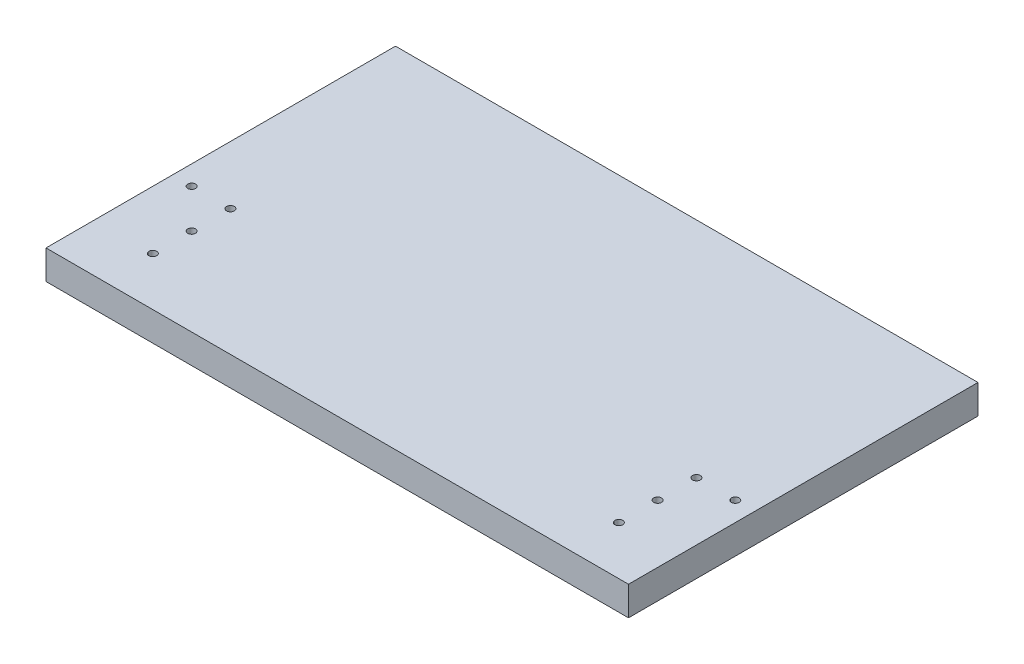
ISO-10303-21;
HEADER;
FILE_DESCRIPTION(('STEP AP214'),'2;1');
FILE_NAME('part.step','',(''),(''),'','','');
FILE_SCHEMA(('AUTOMOTIVE_DESIGN { 1 0 10303 214 1 1 1 1 }'));
ENDSEC;
DATA;
#1=APPLICATION_CONTEXT('core data for automotive mechanical design processes');
#2=APPLICATION_PROTOCOL_DEFINITION('international standard','automotive_design',2000,#1);
#3=PRODUCT_CONTEXT('',#1,'mechanical');
#4=PRODUCT('Part','Part','',(#3));
#5=PRODUCT_RELATED_PRODUCT_CATEGORY('part','',(#4));
#6=PRODUCT_DEFINITION_FORMATION('','',#4);
#7=PRODUCT_DEFINITION_CONTEXT('part definition',#1,'design');
#8=PRODUCT_DEFINITION('design','',#6,#7);
#9=PRODUCT_DEFINITION_SHAPE('','',#8);
#10=(LENGTH_UNIT() NAMED_UNIT(*) SI_UNIT(.MILLI.,.METRE.));
#11=(NAMED_UNIT(*) PLANE_ANGLE_UNIT() SI_UNIT($,.RADIAN.));
#12=(NAMED_UNIT(*) SI_UNIT($,.STERADIAN.) SOLID_ANGLE_UNIT());
#13=UNCERTAINTY_MEASURE_WITH_UNIT(LENGTH_MEASURE(1.E-05),#10,'distance_accuracy_value','');
#14=(GEOMETRIC_REPRESENTATION_CONTEXT(3) GLOBAL_UNCERTAINTY_ASSIGNED_CONTEXT((#13)) GLOBAL_UNIT_ASSIGNED_CONTEXT((#10,
#11,#12)) REPRESENTATION_CONTEXT('',''));
#15=CARTESIAN_POINT('',(0.,0.,0.));
#16=DIRECTION('',(0.,0.,1.));
#17=DIRECTION('',(1.,0.,0.));
#18=AXIS2_PLACEMENT_3D('',#15,#16,#17);
#19=CARTESIAN_POINT('',(150.,15.,90.));
#20=DIRECTION('',(-1.,0.,0.));
#21=DIRECTION('',(0.,0.,1.));
#22=AXIS2_PLACEMENT_3D('',#19,#20,#21);
#23=PLANE('',#22);
#24=DIRECTION('',(0.,0.,-1.));
#25=VECTOR('',#24,1.);
#26=CARTESIAN_POINT('',(150.,0.,90.));
#27=LINE('',#26,#25);
#28=CARTESIAN_POINT('',(150.,0.,90.));
#29=VERTEX_POINT('',#28);
#30=CARTESIAN_POINT('',(150.,0.,-90.));
#31=VERTEX_POINT('',#30);
#32=EDGE_CURVE('E95',#29,#31,#27,.T.);
#33=ORIENTED_EDGE('',*,*,#32,.T.);
#34=DIRECTION('',(0.,-1.,0.));
#35=VECTOR('',#34,1.);
#36=CARTESIAN_POINT('',(150.,15.,-90.));
#37=LINE('',#36,#35);
#38=CARTESIAN_POINT('',(150.,15.,-90.));
#39=VERTEX_POINT('',#38);
#40=EDGE_CURVE('E11',#39,#31,#37,.T.);
#41=ORIENTED_EDGE('',*,*,#40,.F.);
#42=DIRECTION('',(0.,0.,-1.));
#43=VECTOR('',#42,1.);
#44=CARTESIAN_POINT('',(150.,15.,90.));
#45=LINE('',#44,#43);
#46=CARTESIAN_POINT('',(150.,15.,90.));
#47=VERTEX_POINT('',#46);
#48=EDGE_CURVE('E83',#47,#39,#45,.T.);
#49=ORIENTED_EDGE('',*,*,#48,.F.);
#50=DIRECTION('',(0.,-1.,0.));
#51=VECTOR('',#50,1.);
#52=CARTESIAN_POINT('',(150.,15.,90.));
#53=LINE('',#52,#51);
#54=EDGE_CURVE('E91',#47,#29,#53,.T.);
#55=ORIENTED_EDGE('',*,*,#54,.T.);
#56=EDGE_LOOP('',(#33,#41,#49,#55));
#57=FACE_BOUND('',#56,.T.);
#58=ADVANCED_FACE('F32',(#57),#23,.F.);
#59=CARTESIAN_POINT('',(-150.,15.,-90.));
#60=DIRECTION('',(0.,0.,1.));
#61=DIRECTION('',(1.,0.,0.));
#62=AXIS2_PLACEMENT_3D('',#59,#60,#61);
#63=PLANE('',#62);
#64=DIRECTION('',(-1.,0.,0.));
#65=VECTOR('',#64,1.);
#66=CARTESIAN_POINT('',(-150.,0.,-90.));
#67=LINE('',#66,#65);
#68=CARTESIAN_POINT('',(-150.,0.,-90.));
#69=VERTEX_POINT('',#68);
#70=EDGE_CURVE('E87',#31,#69,#67,.T.);
#71=ORIENTED_EDGE('',*,*,#70,.T.);
#72=DIRECTION('',(0.,-1.,0.));
#73=VECTOR('',#72,1.);
#74=CARTESIAN_POINT('',(-150.,15.,-90.));
#75=LINE('',#74,#73);
#76=CARTESIAN_POINT('',(-150.,15.,-90.));
#77=VERTEX_POINT('',#76);
#78=EDGE_CURVE('E40',#77,#69,#75,.T.);
#79=ORIENTED_EDGE('',*,*,#78,.F.);
#80=DIRECTION('',(-1.,0.,0.));
#81=VECTOR('',#80,1.);
#82=CARTESIAN_POINT('',(-150.,15.,-90.));
#83=LINE('',#82,#81);
#84=EDGE_CURVE('E78',#39,#77,#83,.T.);
#85=ORIENTED_EDGE('',*,*,#84,.F.);
#86=ORIENTED_EDGE('',*,*,#40,.T.);
#87=EDGE_LOOP('',(#71,#79,#85,#86));
#88=FACE_BOUND('',#87,.T.);
#89=ADVANCED_FACE('F86',(#88),#63,.F.);
#90=CARTESIAN_POINT('',(-150.,15.,90.));
#91=DIRECTION('',(1.,0.,0.));
#92=DIRECTION('',(0.,0.,-1.));
#93=AXIS2_PLACEMENT_3D('',#90,#91,#92);
#94=PLANE('',#93);
#95=DIRECTION('',(0.,0.,1.));
#96=VECTOR('',#95,1.);
#97=CARTESIAN_POINT('',(-150.,0.,90.));
#98=LINE('',#97,#96);
#99=CARTESIAN_POINT('',(-150.,0.,90.));
#100=VERTEX_POINT('',#99);
#101=EDGE_CURVE('E65',#69,#100,#98,.T.);
#102=ORIENTED_EDGE('',*,*,#101,.T.);
#103=DIRECTION('',(0.,-1.,0.));
#104=VECTOR('',#103,1.);
#105=CARTESIAN_POINT('',(-150.,15.,90.));
#106=LINE('',#105,#104);
#107=CARTESIAN_POINT('',(-150.,15.,90.));
#108=VERTEX_POINT('',#107);
#109=EDGE_CURVE('E88',#108,#100,#106,.T.);
#110=ORIENTED_EDGE('',*,*,#109,.F.);
#111=DIRECTION('',(0.,0.,1.));
#112=VECTOR('',#111,1.);
#113=CARTESIAN_POINT('',(-150.,15.,90.));
#114=LINE('',#113,#112);
#115=EDGE_CURVE('E81',#77,#108,#114,.T.);
#116=ORIENTED_EDGE('',*,*,#115,.F.);
#117=ORIENTED_EDGE('',*,*,#78,.T.);
#118=EDGE_LOOP('',(#102,#110,#116,#117));
#119=FACE_BOUND('',#118,.T.);
#120=ADVANCED_FACE('F89',(#119),#94,.F.);
#121=CARTESIAN_POINT('',(-150.,15.,90.));
#122=DIRECTION('',(0.,0.,-1.));
#123=DIRECTION('',(-1.,0.,0.));
#124=AXIS2_PLACEMENT_3D('',#121,#122,#123);
#125=PLANE('',#124);
#126=DIRECTION('',(1.,0.,0.));
#127=VECTOR('',#126,1.);
#128=CARTESIAN_POINT('',(-150.,0.,90.));
#129=LINE('',#128,#127);
#130=EDGE_CURVE('E71',#100,#29,#129,.T.);
#131=ORIENTED_EDGE('',*,*,#130,.T.);
#132=ORIENTED_EDGE('',*,*,#54,.F.);
#133=DIRECTION('',(1.,0.,0.));
#134=VECTOR('',#133,1.);
#135=CARTESIAN_POINT('',(-150.,15.,90.));
#136=LINE('',#135,#134);
#137=EDGE_CURVE('E48',#108,#47,#136,.T.);
#138=ORIENTED_EDGE('',*,*,#137,.F.);
#139=ORIENTED_EDGE('',*,*,#109,.T.);
#140=EDGE_LOOP('',(#131,#132,#138,#139));
#141=FACE_BOUND('',#140,.T.);
#142=ADVANCED_FACE('F103',(#141),#125,.F.);
#143=CARTESIAN_POINT('',(0.,15.,0.));
#144=DIRECTION('',(0.,-1.,0.));
#145=DIRECTION('',(0.,0.,-1.));
#146=AXIS2_PLACEMENT_3D('',#143,#144,#145);
#147=PLANE('',#146);
#148=CARTESIAN_POINT('',(140.,15.,25.));
#149=DIRECTION('',(0.,1.,0.));
#150=DIRECTION('',(0.,0.,1.));
#151=AXIS2_PLACEMENT_3D('',#148,#149,#150);
#152=CIRCLE('',#151,2.);
#153=CARTESIAN_POINT('',(140.,15.,27.));
#154=VERTEX_POINT('',#153);
#155=EDGE_CURVE('E151',#154,#154,#152,.T.);
#156=ORIENTED_EDGE('',*,*,#155,.F.);
#157=EDGE_LOOP('',(#156));
#158=FACE_BOUND('',#157,.T.);
#159=CARTESIAN_POINT('',(120.,15.,25.));
#160=DIRECTION('',(0.,1.,0.));
#161=DIRECTION('',(0.,0.,1.));
#162=AXIS2_PLACEMENT_3D('',#159,#160,#161);
#163=CIRCLE('',#162,2.);
#164=CARTESIAN_POINT('',(120.,15.,27.));
#165=VERTEX_POINT('',#164);
#166=EDGE_CURVE('E145',#165,#165,#163,.T.);
#167=ORIENTED_EDGE('',*,*,#166,.F.);
#168=EDGE_LOOP('',(#167));
#169=FACE_BOUND('',#168,.T.);
#170=CARTESIAN_POINT('',(-120.,15.,25.));
#171=DIRECTION('',(0.,1.,0.));
#172=DIRECTION('',(0.,0.,1.));
#173=AXIS2_PLACEMENT_3D('',#170,#171,#172);
#174=CIRCLE('',#173,2.);
#175=CARTESIAN_POINT('',(-120.,15.,27.));
#176=VERTEX_POINT('',#175);
#177=EDGE_CURVE('E139',#176,#176,#174,.T.);
#178=ORIENTED_EDGE('',*,*,#177,.F.);
#179=EDGE_LOOP('',(#178));
#180=FACE_BOUND('',#179,.T.);
#181=CARTESIAN_POINT('',(-140.,15.,25.));
#182=DIRECTION('',(0.,1.,0.));
#183=DIRECTION('',(0.,0.,1.));
#184=AXIS2_PLACEMENT_3D('',#181,#182,#183);
#185=CIRCLE('',#184,2.);
#186=CARTESIAN_POINT('',(-140.,15.,27.));
#187=VERTEX_POINT('',#186);
#188=EDGE_CURVE('E133',#187,#187,#185,.T.);
#189=ORIENTED_EDGE('',*,*,#188,.F.);
#190=EDGE_LOOP('',(#189));
#191=FACE_BOUND('',#190,.T.);
#192=CARTESIAN_POINT('',(120.,15.,45.));
#193=DIRECTION('',(0.,1.,0.));
#194=DIRECTION('',(0.,0.,1.));
#195=AXIS2_PLACEMENT_3D('',#192,#193,#194);
#196=CIRCLE('',#195,2.);
#197=CARTESIAN_POINT('',(120.,15.,47.));
#198=VERTEX_POINT('',#197);
#199=EDGE_CURVE('E127',#198,#198,#196,.T.);
#200=ORIENTED_EDGE('',*,*,#199,.F.);
#201=EDGE_LOOP('',(#200));
#202=FACE_BOUND('',#201,.T.);
#203=CARTESIAN_POINT('',(120.,15.,65.));
#204=DIRECTION('',(0.,1.,0.));
#205=DIRECTION('',(0.,0.,1.));
#206=AXIS2_PLACEMENT_3D('',#203,#204,#205);
#207=CIRCLE('',#206,2.);
#208=CARTESIAN_POINT('',(120.,15.,67.));
#209=VERTEX_POINT('',#208);
#210=EDGE_CURVE('E121',#209,#209,#207,.T.);
#211=ORIENTED_EDGE('',*,*,#210,.F.);
#212=EDGE_LOOP('',(#211));
#213=FACE_BOUND('',#212,.T.);
#214=CARTESIAN_POINT('',(-120.,15.,45.));
#215=DIRECTION('',(0.,1.,0.));
#216=DIRECTION('',(0.,0.,1.));
#217=AXIS2_PLACEMENT_3D('',#214,#215,#216);
#218=CIRCLE('',#217,2.);
#219=CARTESIAN_POINT('',(-120.,15.,47.));
#220=VERTEX_POINT('',#219);
#221=EDGE_CURVE('E115',#220,#220,#218,.T.);
#222=ORIENTED_EDGE('',*,*,#221,.F.);
#223=EDGE_LOOP('',(#222));
#224=FACE_BOUND('',#223,.T.);
#225=CARTESIAN_POINT('',(-120.,15.,65.));
#226=DIRECTION('',(0.,1.,0.));
#227=DIRECTION('',(0.,0.,1.));
#228=AXIS2_PLACEMENT_3D('',#225,#226,#227);
#229=CIRCLE('',#228,2.);
#230=CARTESIAN_POINT('',(-120.,15.,67.));
#231=VERTEX_POINT('',#230);
#232=EDGE_CURVE('E109',#231,#231,#229,.T.);
#233=ORIENTED_EDGE('',*,*,#232,.F.);
#234=EDGE_LOOP('',(#233));
#235=FACE_BOUND('',#234,.T.);
#236=ORIENTED_EDGE('',*,*,#48,.T.);
#237=ORIENTED_EDGE('',*,*,#84,.T.);
#238=ORIENTED_EDGE('',*,*,#115,.T.);
#239=ORIENTED_EDGE('',*,*,#137,.T.);
#240=EDGE_LOOP('',(#236,#237,#238,#239));
#241=FACE_BOUND('',#240,.T.);
#242=ADVANCED_FACE('F79',(#158,#169,#180,#191,#202,#213,#224,#235,#241),#147,.F.);
#243=CARTESIAN_POINT('',(0.,0.,0.));
#244=DIRECTION('',(0.,-1.,0.));
#245=DIRECTION('',(0.,0.,-1.));
#246=AXIS2_PLACEMENT_3D('',#243,#244,#245);
#247=PLANE('',#246);
#248=ORIENTED_EDGE('',*,*,#32,.F.);
#249=ORIENTED_EDGE('',*,*,#130,.F.);
#250=ORIENTED_EDGE('',*,*,#101,.F.);
#251=ORIENTED_EDGE('',*,*,#70,.F.);
#252=EDGE_LOOP('',(#248,#249,#250,#251));
#253=FACE_BOUND('',#252,.T.);
#254=ADVANCED_FACE('F106',(#253),#247,.T.);
#255=CARTESIAN_POINT('',(-120.,5.,65.));
#256=DIRECTION('',(0.,1.,0.));
#257=DIRECTION('',(0.,0.,1.));
#258=AXIS2_PLACEMENT_3D('',#255,#256,#257);
#259=CYLINDRICAL_SURFACE('',#258,2.);
#260=CARTESIAN_POINT('',(-120.,5.,65.));
#261=DIRECTION('',(0.,1.,0.));
#262=DIRECTION('',(0.,0.,1.));
#263=AXIS2_PLACEMENT_3D('',#260,#261,#262);
#264=CIRCLE('',#263,2.);
#265=CARTESIAN_POINT('',(-120.,5.,67.));
#266=VERTEX_POINT('',#265);
#267=EDGE_CURVE('E98',#266,#266,#264,.T.);
#268=ORIENTED_EDGE('',*,*,#267,.F.);
#269=EDGE_LOOP('',(#268));
#270=FACE_BOUND('',#269,.T.);
#271=ORIENTED_EDGE('',*,*,#232,.T.);
#272=EDGE_LOOP('',(#271));
#273=FACE_BOUND('',#272,.T.);
#274=ADVANCED_FACE('F183',(#270,#273),#259,.F.);
#275=CARTESIAN_POINT('',(-120.,5.,65.));
#276=DIRECTION('',(0.,1.,0.));
#277=DIRECTION('',(0.,0.,1.));
#278=AXIS2_PLACEMENT_3D('',#275,#276,#277);
#279=PLANE('',#278);
#280=ORIENTED_EDGE('',*,*,#267,.T.);
#281=EDGE_LOOP('',(#280));
#282=FACE_BOUND('',#281,.T.);
#283=ADVANCED_FACE('F185',(#282),#279,.T.);
#284=CARTESIAN_POINT('',(-120.,5.,45.));
#285=DIRECTION('',(0.,1.,0.));
#286=DIRECTION('',(0.,0.,1.));
#287=AXIS2_PLACEMENT_3D('',#284,#285,#286);
#288=CYLINDRICAL_SURFACE('',#287,2.);
#289=CARTESIAN_POINT('',(-120.,5.,45.));
#290=DIRECTION('',(0.,1.,0.));
#291=DIRECTION('',(0.,0.,1.));
#292=AXIS2_PLACEMENT_3D('',#289,#290,#291);
#293=CIRCLE('',#292,2.);
#294=CARTESIAN_POINT('',(-120.,5.,47.));
#295=VERTEX_POINT('',#294);
#296=EDGE_CURVE('E112',#295,#295,#293,.T.);
#297=ORIENTED_EDGE('',*,*,#296,.F.);
#298=EDGE_LOOP('',(#297));
#299=FACE_BOUND('',#298,.T.);
#300=ORIENTED_EDGE('',*,*,#221,.T.);
#301=EDGE_LOOP('',(#300));
#302=FACE_BOUND('',#301,.T.);
#303=ADVANCED_FACE('F192',(#299,#302),#288,.F.);
#304=CARTESIAN_POINT('',(-120.,5.,45.));
#305=DIRECTION('',(0.,1.,0.));
#306=DIRECTION('',(0.,0.,1.));
#307=AXIS2_PLACEMENT_3D('',#304,#305,#306);
#308=PLANE('',#307);
#309=ORIENTED_EDGE('',*,*,#296,.T.);
#310=EDGE_LOOP('',(#309));
#311=FACE_BOUND('',#310,.T.);
#312=ADVANCED_FACE('F240',(#311),#308,.T.);
#313=CARTESIAN_POINT('',(120.,5.,65.));
#314=DIRECTION('',(0.,1.,0.));
#315=DIRECTION('',(0.,0.,1.));
#316=AXIS2_PLACEMENT_3D('',#313,#314,#315);
#317=CYLINDRICAL_SURFACE('',#316,2.);
#318=CARTESIAN_POINT('',(120.,5.,65.));
#319=DIRECTION('',(0.,1.,0.));
#320=DIRECTION('',(0.,0.,1.));
#321=AXIS2_PLACEMENT_3D('',#318,#319,#320);
#322=CIRCLE('',#321,2.);
#323=CARTESIAN_POINT('',(120.,5.,67.));
#324=VERTEX_POINT('',#323);
#325=EDGE_CURVE('E118',#324,#324,#322,.T.);
#326=ORIENTED_EDGE('',*,*,#325,.F.);
#327=EDGE_LOOP('',(#326));
#328=FACE_BOUND('',#327,.T.);
#329=ORIENTED_EDGE('',*,*,#210,.T.);
#330=EDGE_LOOP('',(#329));
#331=FACE_BOUND('',#330,.T.);
#332=ADVANCED_FACE('F249',(#328,#331),#317,.F.);
#333=CARTESIAN_POINT('',(120.,5.,65.));
#334=DIRECTION('',(0.,1.,0.));
#335=DIRECTION('',(0.,0.,1.));
#336=AXIS2_PLACEMENT_3D('',#333,#334,#335);
#337=PLANE('',#336);
#338=ORIENTED_EDGE('',*,*,#325,.T.);
#339=EDGE_LOOP('',(#338));
#340=FACE_BOUND('',#339,.T.);
#341=ADVANCED_FACE('F258',(#340),#337,.T.);
#342=CARTESIAN_POINT('',(120.,5.,45.));
#343=DIRECTION('',(0.,1.,0.));
#344=DIRECTION('',(0.,0.,1.));
#345=AXIS2_PLACEMENT_3D('',#342,#343,#344);
#346=CYLINDRICAL_SURFACE('',#345,2.);
#347=CARTESIAN_POINT('',(120.,5.,45.));
#348=DIRECTION('',(0.,1.,0.));
#349=DIRECTION('',(0.,0.,1.));
#350=AXIS2_PLACEMENT_3D('',#347,#348,#349);
#351=CIRCLE('',#350,2.);
#352=CARTESIAN_POINT('',(120.,5.,47.));
#353=VERTEX_POINT('',#352);
#354=EDGE_CURVE('E124',#353,#353,#351,.T.);
#355=ORIENTED_EDGE('',*,*,#354,.F.);
#356=EDGE_LOOP('',(#355));
#357=FACE_BOUND('',#356,.T.);
#358=ORIENTED_EDGE('',*,*,#199,.T.);
#359=EDGE_LOOP('',(#358));
#360=FACE_BOUND('',#359,.T.);
#361=ADVANCED_FACE('F267',(#357,#360),#346,.F.);
#362=CARTESIAN_POINT('',(120.,5.,45.));
#363=DIRECTION('',(0.,1.,0.));
#364=DIRECTION('',(0.,0.,1.));
#365=AXIS2_PLACEMENT_3D('',#362,#363,#364);
#366=PLANE('',#365);
#367=ORIENTED_EDGE('',*,*,#354,.T.);
#368=EDGE_LOOP('',(#367));
#369=FACE_BOUND('',#368,.T.);
#370=ADVANCED_FACE('F276',(#369),#366,.T.);
#371=CARTESIAN_POINT('',(-140.,5.,25.));
#372=DIRECTION('',(0.,1.,0.));
#373=DIRECTION('',(0.,0.,1.));
#374=AXIS2_PLACEMENT_3D('',#371,#372,#373);
#375=CYLINDRICAL_SURFACE('',#374,2.);
#376=CARTESIAN_POINT('',(-140.,5.,25.));
#377=DIRECTION('',(0.,1.,0.));
#378=DIRECTION('',(0.,0.,1.));
#379=AXIS2_PLACEMENT_3D('',#376,#377,#378);
#380=CIRCLE('',#379,2.);
#381=CARTESIAN_POINT('',(-140.,5.,27.));
#382=VERTEX_POINT('',#381);
#383=EDGE_CURVE('E130',#382,#382,#380,.T.);
#384=ORIENTED_EDGE('',*,*,#383,.F.);
#385=EDGE_LOOP('',(#384));
#386=FACE_BOUND('',#385,.T.);
#387=ORIENTED_EDGE('',*,*,#188,.T.);
#388=EDGE_LOOP('',(#387));
#389=FACE_BOUND('',#388,.T.);
#390=ADVANCED_FACE('F285',(#386,#389),#375,.F.);
#391=CARTESIAN_POINT('',(-140.,5.,25.));
#392=DIRECTION('',(0.,1.,0.));
#393=DIRECTION('',(0.,0.,1.));
#394=AXIS2_PLACEMENT_3D('',#391,#392,#393);
#395=PLANE('',#394);
#396=ORIENTED_EDGE('',*,*,#383,.T.);
#397=EDGE_LOOP('',(#396));
#398=FACE_BOUND('',#397,.T.);
#399=ADVANCED_FACE('F294',(#398),#395,.T.);
#400=CARTESIAN_POINT('',(-120.,5.,25.));
#401=DIRECTION('',(0.,1.,0.));
#402=DIRECTION('',(0.,0.,1.));
#403=AXIS2_PLACEMENT_3D('',#400,#401,#402);
#404=CYLINDRICAL_SURFACE('',#403,2.);
#405=CARTESIAN_POINT('',(-120.,5.,25.));
#406=DIRECTION('',(0.,1.,0.));
#407=DIRECTION('',(0.,0.,1.));
#408=AXIS2_PLACEMENT_3D('',#405,#406,#407);
#409=CIRCLE('',#408,2.);
#410=CARTESIAN_POINT('',(-120.,5.,27.));
#411=VERTEX_POINT('',#410);
#412=EDGE_CURVE('E136',#411,#411,#409,.T.);
#413=ORIENTED_EDGE('',*,*,#412,.F.);
#414=EDGE_LOOP('',(#413));
#415=FACE_BOUND('',#414,.T.);
#416=ORIENTED_EDGE('',*,*,#177,.T.);
#417=EDGE_LOOP('',(#416));
#418=FACE_BOUND('',#417,.T.);
#419=ADVANCED_FACE('F303',(#415,#418),#404,.F.);
#420=CARTESIAN_POINT('',(-120.,5.,25.));
#421=DIRECTION('',(0.,1.,0.));
#422=DIRECTION('',(0.,0.,1.));
#423=AXIS2_PLACEMENT_3D('',#420,#421,#422);
#424=PLANE('',#423);
#425=ORIENTED_EDGE('',*,*,#412,.T.);
#426=EDGE_LOOP('',(#425));
#427=FACE_BOUND('',#426,.T.);
#428=ADVANCED_FACE('F312',(#427),#424,.T.);
#429=CARTESIAN_POINT('',(120.,5.,25.));
#430=DIRECTION('',(0.,1.,0.));
#431=DIRECTION('',(0.,0.,1.));
#432=AXIS2_PLACEMENT_3D('',#429,#430,#431);
#433=CYLINDRICAL_SURFACE('',#432,2.);
#434=CARTESIAN_POINT('',(120.,5.,25.));
#435=DIRECTION('',(0.,1.,0.));
#436=DIRECTION('',(0.,0.,1.));
#437=AXIS2_PLACEMENT_3D('',#434,#435,#436);
#438=CIRCLE('',#437,2.);
#439=CARTESIAN_POINT('',(120.,5.,27.));
#440=VERTEX_POINT('',#439);
#441=EDGE_CURVE('E142',#440,#440,#438,.T.);
#442=ORIENTED_EDGE('',*,*,#441,.F.);
#443=EDGE_LOOP('',(#442));
#444=FACE_BOUND('',#443,.T.);
#445=ORIENTED_EDGE('',*,*,#166,.T.);
#446=EDGE_LOOP('',(#445));
#447=FACE_BOUND('',#446,.T.);
#448=ADVANCED_FACE('F321',(#444,#447),#433,.F.);
#449=CARTESIAN_POINT('',(120.,5.,25.));
#450=DIRECTION('',(0.,1.,0.));
#451=DIRECTION('',(0.,0.,1.));
#452=AXIS2_PLACEMENT_3D('',#449,#450,#451);
#453=PLANE('',#452);
#454=ORIENTED_EDGE('',*,*,#441,.T.);
#455=EDGE_LOOP('',(#454));
#456=FACE_BOUND('',#455,.T.);
#457=ADVANCED_FACE('F162',(#456),#453,.T.);
#458=CARTESIAN_POINT('',(140.,5.,25.));
#459=DIRECTION('',(0.,1.,0.));
#460=DIRECTION('',(0.,0.,1.));
#461=AXIS2_PLACEMENT_3D('',#458,#459,#460);
#462=CYLINDRICAL_SURFACE('',#461,2.);
#463=CARTESIAN_POINT('',(140.,5.,25.));
#464=DIRECTION('',(0.,1.,0.));
#465=DIRECTION('',(0.,0.,1.));
#466=AXIS2_PLACEMENT_3D('',#463,#464,#465);
#467=CIRCLE('',#466,2.);
#468=CARTESIAN_POINT('',(140.,5.,27.));
#469=VERTEX_POINT('',#468);
#470=EDGE_CURVE('E148',#469,#469,#467,.T.);
#471=ORIENTED_EDGE('',*,*,#470,.F.);
#472=EDGE_LOOP('',(#471));
#473=FACE_BOUND('',#472,.T.);
#474=ORIENTED_EDGE('',*,*,#155,.T.);
#475=EDGE_LOOP('',(#474));
#476=FACE_BOUND('',#475,.T.);
#477=ADVANCED_FACE('F159',(#473,#476),#462,.F.);
#478=CARTESIAN_POINT('',(140.,5.,25.));
#479=DIRECTION('',(0.,1.,0.));
#480=DIRECTION('',(0.,0.,1.));
#481=AXIS2_PLACEMENT_3D('',#478,#479,#480);
#482=PLANE('',#481);
#483=ORIENTED_EDGE('',*,*,#470,.T.);
#484=EDGE_LOOP('',(#483));
#485=FACE_BOUND('',#484,.T.);
#486=ADVANCED_FACE('F157',(#485),#482,.T.);
#487=CLOSED_SHELL('',(#58,#89,#120,#142,#242,#254,#274,#283,#303,#312,#332,#341,#361,#370,#390,
#399,#419,#428,#448,#457,#477,#486));
#488=MANIFOLD_SOLID_BREP('B2',#487);
#489=ADVANCED_BREP_SHAPE_REPRESENTATION('',(#18,#488),#14);
#490=SHAPE_DEFINITION_REPRESENTATION(#9,#489);
ENDSEC;
END-ISO-10303-21;
